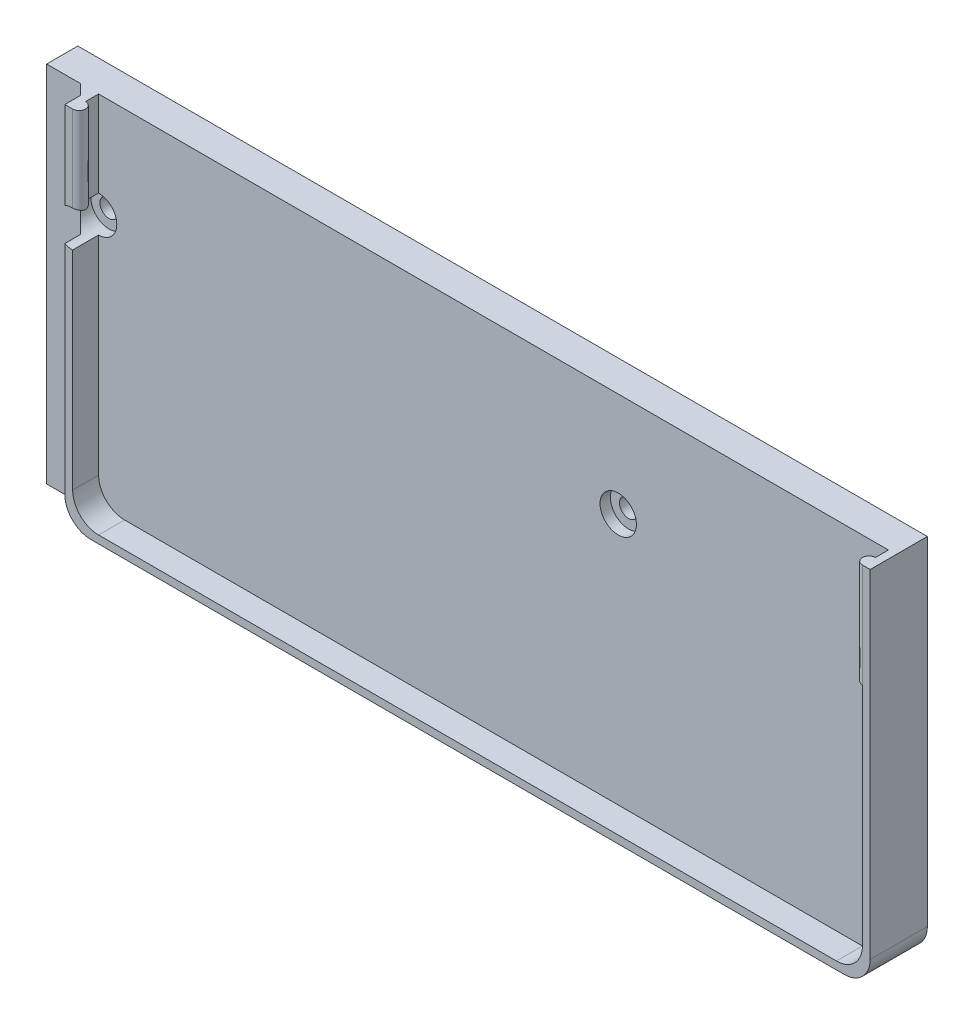
ISO-10303-21;
HEADER;
FILE_DESCRIPTION(('STEP AP214'),'2;1');
FILE_NAME('part.step','',(''),(''),'','','');
FILE_SCHEMA(('AUTOMOTIVE_DESIGN { 1 0 10303 214 1 1 1 1 }'));
ENDSEC;
DATA;
#1=APPLICATION_CONTEXT('core data for automotive mechanical design processes');
#2=APPLICATION_PROTOCOL_DEFINITION('international standard','automotive_design',2000,#1);
#3=PRODUCT_CONTEXT('',#1,'mechanical');
#4=PRODUCT('Part','Part','',(#3));
#5=PRODUCT_RELATED_PRODUCT_CATEGORY('part','',(#4));
#6=PRODUCT_DEFINITION_FORMATION('','',#4);
#7=PRODUCT_DEFINITION_CONTEXT('part definition',#1,'design');
#8=PRODUCT_DEFINITION('design','',#6,#7);
#9=PRODUCT_DEFINITION_SHAPE('','',#8);
#10=(LENGTH_UNIT() NAMED_UNIT(*) SI_UNIT(.MILLI.,.METRE.));
#11=(NAMED_UNIT(*) PLANE_ANGLE_UNIT() SI_UNIT($,.RADIAN.));
#12=(NAMED_UNIT(*) SI_UNIT($,.STERADIAN.) SOLID_ANGLE_UNIT());
#13=UNCERTAINTY_MEASURE_WITH_UNIT(LENGTH_MEASURE(1.E-05),#10,'distance_accuracy_value','');
#14=(GEOMETRIC_REPRESENTATION_CONTEXT(3) GLOBAL_UNCERTAINTY_ASSIGNED_CONTEXT((#13)) GLOBAL_UNIT_ASSIGNED_CONTEXT((#10,
#11,#12)) REPRESENTATION_CONTEXT('',''));
#15=CARTESIAN_POINT('',(0.,0.,0.));
#16=DIRECTION('',(0.,0.,1.));
#17=DIRECTION('',(1.,0.,0.));
#18=AXIS2_PLACEMENT_3D('',#15,#16,#17);
#19=CARTESIAN_POINT('',(-76.,35.,11.));
#20=DIRECTION('',(-1.,0.,0.));
#21=DIRECTION('',(0.,-1.,0.));
#22=AXIS2_PLACEMENT_3D('',#19,#20,#21);
#23=PLANE('',#22);
#24=DIRECTION('',(0.,0.,-1.));
#25=VECTOR('',#24,1.);
#26=CARTESIAN_POINT('',(-76.,18.5,11.));
#27=LINE('',#26,#25);
#28=CARTESIAN_POINT('',(-76.,18.5,6.));
#29=VERTEX_POINT('',#28);
#30=CARTESIAN_POINT('',(-76.,18.5,8.5));
#31=VERTEX_POINT('',#30);
#32=EDGE_CURVE('E203',#29,#31,#27,.F.);
#33=ORIENTED_EDGE('',*,*,#32,.F.);
#34=DIRECTION('',(0.,1.,0.));
#35=VECTOR('',#34,1.);
#36=CARTESIAN_POINT('',(-76.,35.,6.));
#37=LINE('',#36,#35);
#38=CARTESIAN_POINT('',(-76.,35.,6.));
#39=VERTEX_POINT('',#38);
#40=EDGE_CURVE('E289',#29,#39,#37,.T.);
#41=ORIENTED_EDGE('',*,*,#40,.T.);
#42=DIRECTION('',(0.,0.,-1.));
#43=VECTOR('',#42,1.);
#44=CARTESIAN_POINT('',(-76.,35.,11.));
#45=LINE('',#44,#43);
#46=CARTESIAN_POINT('',(-76.,35.,8.5));
#47=VERTEX_POINT('',#46);
#48=EDGE_CURVE('E281',#47,#39,#45,.T.);
#49=ORIENTED_EDGE('',*,*,#48,.F.);
#50=DIRECTION('',(0.,1.,0.));
#51=VECTOR('',#50,1.);
#52=CARTESIAN_POINT('',(-76.,15.,8.5));
#53=LINE('',#52,#51);
#54=EDGE_CURVE('E228',#31,#47,#53,.T.);
#55=ORIENTED_EDGE('',*,*,#54,.F.);
#56=EDGE_LOOP('',(#33,#41,#49,#55));
#57=FACE_BOUND('',#56,.T.);
#58=ADVANCED_FACE('F43',(#57),#23,.F.);
#59=CARTESIAN_POINT('',(-77.5,-35.,6.));
#60=DIRECTION('',(1.,0.,0.));
#61=DIRECTION('',(0.,0.,-1.));
#62=AXIS2_PLACEMENT_3D('',#59,#60,#61);
#63=PLANE('',#62);
#64=DIRECTION('',(0.,0.,-1.));
#65=VECTOR('',#64,1.);
#66=CARTESIAN_POINT('',(-77.5,11.8377223398316,11.));
#67=LINE('',#66,#65);
#68=CARTESIAN_POINT('',(-77.5,11.8377223398316,8.));
#69=VERTEX_POINT('',#68);
#70=CARTESIAN_POINT('',(-77.5,11.8377223398316,11.));
#71=VERTEX_POINT('',#70);
#72=EDGE_CURVE('E454',#69,#71,#67,.F.);
#73=ORIENTED_EDGE('',*,*,#72,.F.);
#74=DIRECTION('',(0.,-1.,0.));
#75=VECTOR('',#74,1.);
#76=CARTESIAN_POINT('',(-77.5,-35.,8.));
#77=LINE('',#76,#75);
#78=CARTESIAN_POINT('',(-77.5,-30.,8.));
#79=VERTEX_POINT('',#78);
#80=EDGE_CURVE('E385',#69,#79,#77,.T.);
#81=ORIENTED_EDGE('',*,*,#80,.T.);
#82=DIRECTION('',(0.,0.,-1.));
#83=VECTOR('',#82,1.);
#84=CARTESIAN_POINT('',(-77.5,-30.,6.));
#85=LINE('',#84,#83);
#86=CARTESIAN_POINT('',(-77.5,-30.,11.));
#87=VERTEX_POINT('',#86);
#88=EDGE_CURVE('E368',#79,#87,#85,.F.);
#89=ORIENTED_EDGE('',*,*,#88,.T.);
#90=DIRECTION('',(0.,-1.,0.));
#91=VECTOR('',#90,1.);
#92=CARTESIAN_POINT('',(-77.5,35.,11.));
#93=LINE('',#92,#91);
#94=EDGE_CURVE('E254',#71,#87,#93,.T.);
#95=ORIENTED_EDGE('',*,*,#94,.F.);
#96=EDGE_LOOP('',(#73,#81,#89,#95));
#97=FACE_BOUND('',#96,.T.);
#98=ADVANCED_FACE('F431',(#97),#63,.F.);
#99=DIRECTION('',(0.,0.,-1.));
#100=VECTOR('',#99,1.);
#101=CARTESIAN_POINT('',(-76.,11.5,11.));
#102=LINE('',#101,#100);
#103=CARTESIAN_POINT('',(-76.,11.5,11.));
#104=VERTEX_POINT('',#103);
#105=CARTESIAN_POINT('',(-76.,11.5,6.));
#106=VERTEX_POINT('',#105);
#107=EDGE_CURVE('E208',#104,#106,#102,.T.);
#108=ORIENTED_EDGE('',*,*,#107,.F.);
#109=DIRECTION('',(0.,1.,0.));
#110=VECTOR('',#109,1.);
#111=CARTESIAN_POINT('',(-76.,35.,11.));
#112=LINE('',#111,#110);
#113=CARTESIAN_POINT('',(-76.,-28.5,11.));
#114=VERTEX_POINT('',#113);
#115=EDGE_CURVE('E274',#114,#104,#112,.T.);
#116=ORIENTED_EDGE('',*,*,#115,.F.);
#117=DIRECTION('',(0.,0.,-1.));
#118=VECTOR('',#117,1.);
#119=CARTESIAN_POINT('',(-76.,-28.5,6.));
#120=LINE('',#119,#118);
#121=CARTESIAN_POINT('',(-76.,-28.5,6.));
#122=VERTEX_POINT('',#121);
#123=EDGE_CURVE('E338',#114,#122,#120,.T.);
#124=ORIENTED_EDGE('',*,*,#123,.T.);
#125=EDGE_CURVE('E290',#122,#106,#37,.T.);
#126=ORIENTED_EDGE('',*,*,#125,.T.);
#127=EDGE_LOOP('',(#108,#116,#124,#126));
#128=FACE_BOUND('',#127,.T.);
#129=ADVANCED_FACE('F434',(#128),#23,.F.);
#130=DIRECTION('',(0.,0.,-1.));
#131=VECTOR('',#130,1.);
#132=CARTESIAN_POINT('',(-77.5,35.,6.));
#133=LINE('',#132,#131);
#134=CARTESIAN_POINT('',(-77.5,35.,11.));
#135=VERTEX_POINT('',#134);
#136=CARTESIAN_POINT('',(-77.5,35.,8.));
#137=VERTEX_POINT('',#136);
#138=EDGE_CURVE('E305',#135,#137,#133,.T.);
#139=ORIENTED_EDGE('',*,*,#138,.T.);
#140=DIRECTION('',(0.,-1.,0.));
#141=VECTOR('',#140,1.);
#142=CARTESIAN_POINT('',(-77.5,-35.,8.));
#143=LINE('',#142,#141);
#144=CARTESIAN_POINT('',(-77.5,18.1622776601683,8.));
#145=VERTEX_POINT('',#144);
#146=EDGE_CURVE('E388',#137,#145,#143,.T.);
#147=ORIENTED_EDGE('',*,*,#146,.T.);
#148=DIRECTION('',(0.,0.,-1.));
#149=VECTOR('',#148,1.);
#150=CARTESIAN_POINT('',(-77.5,18.1622776601683,11.));
#151=LINE('',#150,#149);
#152=CARTESIAN_POINT('',(-77.5,18.1622776601683,11.));
#153=VERTEX_POINT('',#152);
#154=EDGE_CURVE('E219',#153,#145,#151,.T.);
#155=ORIENTED_EDGE('',*,*,#154,.F.);
#156=EDGE_CURVE('E217',#135,#153,#93,.T.);
#157=ORIENTED_EDGE('',*,*,#156,.F.);
#158=EDGE_LOOP('',(#139,#147,#155,#157));
#159=FACE_BOUND('',#158,.T.);
#160=ADVANCED_FACE('F439',(#159),#63,.F.);
#161=CARTESIAN_POINT('',(-76.,15.,9.75));
#162=DIRECTION('',(0.,1.,0.));
#163=DIRECTION('',(-1.,0.,0.));
#164=AXIS2_PLACEMENT_3D('',#161,#162,#163);
#165=CYLINDRICAL_SURFACE('',#164,1.25);
#166=CARTESIAN_POINT('',(-76.,18.5,8.5));
#167=CARTESIAN_POINT('',(-75.9659757904319,18.5000026683283,8.49999907683071));
#168=CARTESIAN_POINT('',(-75.9319688547805,18.4995032816792,8.50139008495954));
#169=CARTESIAN_POINT('',(-75.864217584946,18.4975289487794,8.50693175917107));
#170=CARTESIAN_POINT('',(-75.8304731865727,18.4960542490934,8.51108172777475));
#171=CARTESIAN_POINT('',(-75.7302073943591,18.4902245695908,8.5275924385276));
#172=CARTESIAN_POINT('',(-75.6643885949796,18.4844635651872,8.54401442577793));
#173=CARTESIAN_POINT('',(-75.5366547082636,18.4697918359865,8.58708958889776));
#174=CARTESIAN_POINT('',(-75.4747377608142,18.4608826256113,8.61373784602236));
#175=CARTESIAN_POINT('',(-75.3562241417227,18.440809192101,8.67643185981238));
#176=CARTESIAN_POINT('',(-75.2996305798288,18.4296436627403,8.71248306355123));
#177=CARTESIAN_POINT('',(-75.1912060790333,18.4057370816355,8.79442096281969));
#178=CARTESIAN_POINT('',(-75.1396113591823,18.392954546177,8.84060790552855));
#179=CARTESIAN_POINT('',(-75.0447105996287,18.3674680187645,8.94087143656938));
#180=CARTESIAN_POINT('',(-75.0014070313663,18.3547640513187,8.99495036891979));
#181=CARTESIAN_POINT('',(-74.922880473595,18.3304001061877,9.11170007488475));
#182=CARTESIAN_POINT('',(-74.8879809552402,18.3187900803079,9.17459986308374));
#183=CARTESIAN_POINT('',(-74.8293612147054,18.2985714206393,9.3058545348867));
#184=CARTESIAN_POINT('',(-74.8056365584818,18.289961596762,9.37420724223113));
#185=CARTESIAN_POINT('',(-74.770954515659,18.2771602545628,9.51171073731794));
#186=CARTESIAN_POINT('',(-74.7595476309359,18.2728137537401,9.58073326043892));
#187=CARTESIAN_POINT('',(-74.7484192355344,18.2685753081462,9.71984040223422));
#188=CARTESIAN_POINT('',(-74.7486936919814,18.2686818260114,9.78992464600614));
#189=CARTESIAN_POINT('',(-74.7605746424022,18.273202956084,9.92517826816106));
#190=CARTESIAN_POINT('',(-74.7715743349314,18.2773868746983,9.99041004961843));
#191=CARTESIAN_POINT('',(-74.8035960297355,18.289210512782,10.1180315991849));
#192=CARTESIAN_POINT('',(-74.8246192674017,18.2968506582217,10.1804210159368));
#193=CARTESIAN_POINT('',(-74.8764521600179,18.3148758556283,10.3018868924054));
#194=CARTESIAN_POINT('',(-74.9074289864255,18.3253072461456,10.3608848378626));
#195=CARTESIAN_POINT('',(-74.9781737204176,18.3477223570999,10.4730282359576));
#196=CARTESIAN_POINT('',(-75.0179444487767,18.3597065751175,10.5261718025031));
#197=CARTESIAN_POINT('',(-75.1079806205524,18.3847615419392,10.6284758978067));
#198=CARTESIAN_POINT('',(-75.1587350177102,18.3978541865051,10.6772016768853));
#199=CARTESIAN_POINT('',(-75.2678612729399,18.4230255783854,10.7655800316741));
#200=CARTESIAN_POINT('',(-75.3262352118476,18.4351040472505,10.8052301207113));
#201=CARTESIAN_POINT('',(-75.4499807941009,18.4570910587843,10.8747592459903));
#202=CARTESIAN_POINT('',(-75.5154353921905,18.4669685082592,10.9045008936965));
#203=CARTESIAN_POINT('',(-75.6508270205677,18.4832028361184,10.9523787560176));
#204=CARTESIAN_POINT('',(-75.7207572036335,18.4895649554513,10.9705322535262));
#205=CARTESIAN_POINT('',(-75.8261479716852,18.4958506132377,10.988344283457));
#206=CARTESIAN_POINT('',(-75.860776369585,18.4974025097797,10.9927127455016));
#207=CARTESIAN_POINT('',(-75.9302635093121,18.4994779139932,10.9985390828793));
#208=CARTESIAN_POINT('',(-75.9651219053432,18.5000027168634,11.0000006239726));
#209=CARTESIAN_POINT('',(-76.,18.5000000000001,11.0000000000002));
#210=B_SPLINE_CURVE_WITH_KNOTS('',3,(#166,#167,#168,#169,#170,#171,#172,#173,#174,#175,#176,
#177,#178,#179,#180,#181,#182,#183,#184,#185,#186,#187,#188,#189,#190,#191,#192,#193,#194,#195,
#196,#197,#198,#199,#200,#201,#202,#203,#204,#205,#206,#207,#208,#209),.UNSPECIFIED.,.F.,.F.,(4,
2,2,2,2,2,2,2,2,2,2,2,2,2,2,2,2,2,2,2,2,4),(0.,0.102006778343278,0.203987778663533,
0.407165932526253,0.610246481746047,0.813444936675671,1.02375999820424,1.23413765352075,
1.45164280743171,1.66906158520247,1.8782461980126,2.08735859236272,2.2852880405023,
2.48324188954616,2.68471130666592,2.88624544208698,3.09995801092077,3.31372906553626,
3.53035156417599,3.7466502263919,3.85134354778704,3.9559047622036),.UNSPECIFIED.);
#211=CARTESIAN_POINT('',(-76.,18.5,11.));
#212=VERTEX_POINT('',#211);
#213=EDGE_CURVE('E196',#31,#212,#210,.T.);
#214=ORIENTED_EDGE('',*,*,#213,.F.);
#215=ORIENTED_EDGE('',*,*,#54,.T.);
#216=CARTESIAN_POINT('',(-76.,35.,9.75));
#217=DIRECTION('',(0.,-1.,0.));
#218=DIRECTION('',(1.,0.,0.));
#219=AXIS2_PLACEMENT_3D('',#216,#217,#218);
#220=CIRCLE('',#219,1.25);
#221=CARTESIAN_POINT('',(-76.,35.,11.));
#222=VERTEX_POINT('',#221);
#223=EDGE_CURVE('E224',#47,#222,#220,.T.);
#224=ORIENTED_EDGE('',*,*,#223,.T.);
#225=DIRECTION('',(0.,1.,0.));
#226=VECTOR('',#225,1.);
#227=CARTESIAN_POINT('',(-76.,15.,11.));
#228=LINE('',#227,#226);
#229=EDGE_CURVE('E214',#212,#222,#228,.T.);
#230=ORIENTED_EDGE('',*,*,#229,.F.);
#231=EDGE_LOOP('',(#214,#215,#224,#230));
#232=FACE_BOUND('',#231,.T.);
#233=ADVANCED_FACE('F222',(#232),#165,.T.);
#234=CARTESIAN_POINT('',(0.,0.,11.));
#235=DIRECTION('',(0.,0.,1.));
#236=DIRECTION('',(1.,0.,0.));
#237=AXIS2_PLACEMENT_3D('',#234,#235,#236);
#238=PLANE('',#237);
#239=ORIENTED_EDGE('',*,*,#156,.T.);
#240=CARTESIAN_POINT('',(-76.,15.,11.));
#241=DIRECTION('',(0.,0.,1.));
#242=DIRECTION('',(1.,0.,0.));
#243=AXIS2_PLACEMENT_3D('',#240,#241,#242);
#244=CIRCLE('',#243,3.50000000000001);
#245=EDGE_CURVE('E201',#212,#153,#244,.T.);
#246=ORIENTED_EDGE('',*,*,#245,.F.);
#247=ORIENTED_EDGE('',*,*,#229,.T.);
#248=DIRECTION('',(-1.,0.,0.));
#249=VECTOR('',#248,1.);
#250=CARTESIAN_POINT('',(-77.5,35.,11.));
#251=LINE('',#250,#249);
#252=EDGE_CURVE('E278',#222,#135,#251,.T.);
#253=ORIENTED_EDGE('',*,*,#252,.T.);
#254=EDGE_LOOP('',(#239,#246,#247,#253));
#255=FACE_BOUND('',#254,.T.);
#256=ADVANCED_FACE('F212',(#255),#238,.T.);
#257=CARTESIAN_POINT('',(77.5,-35.,6.));
#258=DIRECTION('',(0.,1.,0.));
#259=DIRECTION('',(-1.,0.,0.));
#260=AXIS2_PLACEMENT_3D('',#257,#258,#259);
#261=PLANE('',#260);
#262=DIRECTION('',(1.,0.,0.));
#263=VECTOR('',#262,1.);
#264=CARTESIAN_POINT('',(77.5,-35.,0.));
#265=LINE('',#264,#263);
#266=CARTESIAN_POINT('',(-86.,-35.,0.));
#267=VERTEX_POINT('',#266);
#268=CARTESIAN_POINT('',(72.5,-35.,0.));
#269=VERTEX_POINT('',#268);
#270=EDGE_CURVE('E300',#267,#269,#265,.T.);
#271=ORIENTED_EDGE('',*,*,#270,.T.);
#272=DIRECTION('',(0.,0.,-1.));
#273=VECTOR('',#272,1.);
#274=CARTESIAN_POINT('',(72.5,-35.,6.));
#275=LINE('',#274,#273);
#276=CARTESIAN_POINT('',(72.5,-35.,11.));
#277=VERTEX_POINT('',#276);
#278=EDGE_CURVE('E359',#269,#277,#275,.F.);
#279=ORIENTED_EDGE('',*,*,#278,.T.);
#280=DIRECTION('',(1.,0.,0.));
#281=VECTOR('',#280,1.);
#282=CARTESIAN_POINT('',(-77.5,-35.,11.));
#283=LINE('',#282,#281);
#284=CARTESIAN_POINT('',(-72.5,-35.,11.));
#285=VERTEX_POINT('',#284);
#286=EDGE_CURVE('E253',#285,#277,#283,.T.);
#287=ORIENTED_EDGE('',*,*,#286,.F.);
#288=DIRECTION('',(0.,0.,-1.));
#289=VECTOR('',#288,1.);
#290=CARTESIAN_POINT('',(-72.5,-35.,6.));
#291=LINE('',#290,#289);
#292=CARTESIAN_POINT('',(-72.5,-35.,8.));
#293=VERTEX_POINT('',#292);
#294=EDGE_CURVE('E355',#285,#293,#291,.T.);
#295=ORIENTED_EDGE('',*,*,#294,.T.);
#296=CARTESIAN_POINT('',(-72.5,-35.,8.));
#297=CARTESIAN_POINT('',(-72.5768933228156,-35.,8.00000620131336));
#298=CARTESIAN_POINT('',(-72.6537753473376,-35.,7.99822533589672));
#299=CARTESIAN_POINT('',(-72.8073651302601,-35.,7.99114778382127));
#300=CARTESIAN_POINT('',(-72.8840729152158,-35.,7.9858516748292));
#301=CARTESIAN_POINT('',(-73.1134205585133,-35.,7.96480683785419));
#302=CARTESIAN_POINT('',(-73.2656120972033,-35.,7.94390110288721));
#303=CARTESIAN_POINT('',(-73.5650305487638,-35.,7.88991735069916));
#304=CARTESIAN_POINT('',(-73.7122977683057,-35.,7.85705747256989));
#305=CARTESIAN_POINT('',(-74.0040195360666,-35.,7.78058856410912));
#306=CARTESIAN_POINT('',(-74.1484732137249,-35.,7.73697626205266));
#307=CARTESIAN_POINT('',(-74.5663706327561,-35.,7.59604187330244));
#308=CARTESIAN_POINT('',(-74.8356598401198,-35.,7.4863290838687));
#309=CARTESIAN_POINT('',(-75.231312657729,-35.,7.30382931353176));
#310=CARTESIAN_POINT('',(-75.3619881348855,-35.,7.23990883041286));
#311=CARTESIAN_POINT('',(-75.6207671752578,-35.,7.10705031745801));
#312=CARTESIAN_POINT('',(-75.7488710267653,-35.,7.03811285410279));
#313=CARTESIAN_POINT('',(-76.0074735057834,-35.,6.89340854084567));
#314=CARTESIAN_POINT('',(-76.1378824406127,-35.,6.81748268239323));
#315=CARTESIAN_POINT('',(-76.3964566201314,-35.,6.66188374413012));
#316=CARTESIAN_POINT('',(-76.5246216538159,-35.,6.58221031448676));
#317=CARTESIAN_POINT('',(-76.7781667463039,-35.,6.42024010655214));
#318=CARTESIAN_POINT('',(-76.9035590847409,-35.,6.33796247399148));
#319=CARTESIAN_POINT('',(-77.1525491232897,-35.,6.17081460821925));
#320=CARTESIAN_POINT('',(-77.2761473712528,-35.,6.08594519210924));
#321=CARTESIAN_POINT('',(-77.3989794855663,-35.,6.00000000000001));
#322=B_SPLINE_CURVE_WITH_KNOTS('',3,(#296,#297,#298,#299,#300,#301,#302,#303,#304,#305,#306,
#307,#308,#309,#310,#311,#312,#313,#314,#315,#316,#317,#318,#319,#320,#321),.UNSPECIFIED.,.F.,
.F.,(4,2,2,2,2,2,2,2,2,2,2,2,4),(0.,0.230637768104905,0.461237644442019,0.921458930578871,
1.37367193963626,1.82602271730549,2.6963792839674,3.13274134755843,3.56905421655104,
4.02168948163026,4.47436708402284,4.92426088396873,5.37401428286144),.UNSPECIFIED.);
#323=CARTESIAN_POINT('',(-77.3989794855663,-35.,6.00000000000001));
#324=VERTEX_POINT('',#323);
#325=EDGE_CURVE('E391',#293,#324,#322,.T.);
#326=ORIENTED_EDGE('',*,*,#325,.T.);
#327=DIRECTION('',(-1.,0.,0.));
#328=VECTOR('',#327,1.);
#329=CARTESIAN_POINT('',(0.,-35.,6.00000000000001));
#330=LINE('',#329,#328);
#331=CARTESIAN_POINT('',(-86.,-35.,6.00000000000001));
#332=VERTEX_POINT('',#331);
#333=EDGE_CURVE('E502',#324,#332,#330,.T.);
#334=ORIENTED_EDGE('',*,*,#333,.T.);
#335=DIRECTION('',(0.,0.,-1.));
#336=VECTOR('',#335,1.);
#337=CARTESIAN_POINT('',(-86.,-35.,77.2899011080813));
#338=LINE('',#337,#336);
#339=EDGE_CURVE('E505',#332,#267,#338,.T.);
#340=ORIENTED_EDGE('',*,*,#339,.T.);
#341=EDGE_LOOP('',(#271,#279,#287,#295,#326,#334,#340));
#342=FACE_BOUND('',#341,.T.);
#343=ADVANCED_FACE('F402',(#342),#261,.F.);
#344=CARTESIAN_POINT('',(77.5,-35.,6.));
#345=DIRECTION('',(-1.,0.,0.));
#346=DIRECTION('',(0.,0.,1.));
#347=AXIS2_PLACEMENT_3D('',#344,#345,#346);
#348=PLANE('',#347);
#349=DIRECTION('',(0.,1.,0.));
#350=VECTOR('',#349,1.);
#351=CARTESIAN_POINT('',(77.5,-35.,11.));
#352=LINE('',#351,#350);
#353=CARTESIAN_POINT('',(77.5,-30.,11.));
#354=VERTEX_POINT('',#353);
#355=CARTESIAN_POINT('',(77.5,35.,11.));
#356=VERTEX_POINT('',#355);
#357=EDGE_CURVE('E258',#354,#356,#352,.T.);
#358=ORIENTED_EDGE('',*,*,#357,.F.);
#359=DIRECTION('',(0.,0.,-1.));
#360=VECTOR('',#359,1.);
#361=CARTESIAN_POINT('',(77.5,-30.,6.));
#362=LINE('',#361,#360);
#363=CARTESIAN_POINT('',(77.5,-30.,0.));
#364=VERTEX_POINT('',#363);
#365=EDGE_CURVE('E348',#354,#364,#362,.T.);
#366=ORIENTED_EDGE('',*,*,#365,.T.);
#367=DIRECTION('',(0.,1.,0.));
#368=VECTOR('',#367,1.);
#369=CARTESIAN_POINT('',(77.5,-35.,0.));
#370=LINE('',#369,#368);
#371=CARTESIAN_POINT('',(77.5,35.,0.));
#372=VERTEX_POINT('',#371);
#373=EDGE_CURVE('E310',#364,#372,#370,.T.);
#374=ORIENTED_EDGE('',*,*,#373,.T.);
#375=DIRECTION('',(0.,0.,-1.));
#376=VECTOR('',#375,1.);
#377=CARTESIAN_POINT('',(77.5,35.,6.));
#378=LINE('',#377,#376);
#379=EDGE_CURVE('E317',#356,#372,#378,.T.);
#380=ORIENTED_EDGE('',*,*,#379,.F.);
#381=EDGE_LOOP('',(#358,#366,#374,#380));
#382=FACE_BOUND('',#381,.T.);
#383=ADVANCED_FACE('F535',(#382),#348,.F.);
#384=CARTESIAN_POINT('',(77.5,35.,6.));
#385=DIRECTION('',(0.,-1.,0.));
#386=DIRECTION('',(1.,0.,0.));
#387=AXIS2_PLACEMENT_3D('',#384,#385,#386);
#388=PLANE('',#387);
#389=DIRECTION('',(-1.,0.,0.));
#390=VECTOR('',#389,1.);
#391=CARTESIAN_POINT('',(77.5,35.,0.));
#392=LINE('',#391,#390);
#393=CARTESIAN_POINT('',(-86.,35.,0.));
#394=VERTEX_POINT('',#393);
#395=EDGE_CURVE('E306',#372,#394,#392,.T.);
#396=ORIENTED_EDGE('',*,*,#395,.T.);
#397=DIRECTION('',(0.,0.,-1.));
#398=VECTOR('',#397,1.);
#399=CARTESIAN_POINT('',(-86.,35.,77.2899011080813));
#400=LINE('',#399,#398);
#401=CARTESIAN_POINT('',(-86.,35.,6.00000000000001));
#402=VERTEX_POINT('',#401);
#403=EDGE_CURVE('E501',#402,#394,#400,.T.);
#404=ORIENTED_EDGE('',*,*,#403,.F.);
#405=DIRECTION('',(-1.,0.,0.));
#406=VECTOR('',#405,1.);
#407=CARTESIAN_POINT('',(0.,35.,6.00000000000001));
#408=LINE('',#407,#406);
#409=CARTESIAN_POINT('',(-79.5,35.,6.00000000000001));
#410=VERTEX_POINT('',#409);
#411=EDGE_CURVE('E493',#410,#402,#408,.T.);
#412=ORIENTED_EDGE('',*,*,#411,.F.);
#413=DIRECTION('',(0.707106781186548,0.,0.707106781186548));
#414=VECTOR('',#413,1.);
#415=CARTESIAN_POINT('',(-0.999999999999973,35.,84.5));
#416=LINE('',#415,#414);
#417=EDGE_CURVE('E11',#410,#137,#416,.T.);
#418=ORIENTED_EDGE('',*,*,#417,.T.);
#419=ORIENTED_EDGE('',*,*,#138,.F.);
#420=ORIENTED_EDGE('',*,*,#252,.F.);
#421=ORIENTED_EDGE('',*,*,#223,.F.);
#422=ORIENTED_EDGE('',*,*,#48,.T.);
#423=DIRECTION('',(-1.,0.,0.));
#424=VECTOR('',#423,1.);
#425=CARTESIAN_POINT('',(77.5,35.,6.));
#426=LINE('',#425,#424);
#427=CARTESIAN_POINT('',(76.,35.,6.));
#428=VERTEX_POINT('',#427);
#429=EDGE_CURVE('E301',#428,#39,#426,.T.);
#430=ORIENTED_EDGE('',*,*,#429,.F.);
#431=DIRECTION('',(0.,0.,-1.));
#432=VECTOR('',#431,1.);
#433=CARTESIAN_POINT('',(76.,35.,11.));
#434=LINE('',#433,#432);
#435=CARTESIAN_POINT('',(76.,35.,8.5));
#436=VERTEX_POINT('',#435);
#437=EDGE_CURVE('E297',#436,#428,#434,.T.);
#438=ORIENTED_EDGE('',*,*,#437,.F.);
#439=CARTESIAN_POINT('',(76.,35.,9.75));
#440=DIRECTION('',(0.,1.,0.));
#441=DIRECTION('',(-1.,0.,0.));
#442=AXIS2_PLACEMENT_3D('',#439,#440,#441);
#443=CIRCLE('',#442,1.25);
#444=CARTESIAN_POINT('',(76.,35.,11.));
#445=VERTEX_POINT('',#444);
#446=EDGE_CURVE('E227',#436,#445,#443,.T.);
#447=ORIENTED_EDGE('',*,*,#446,.T.);
#448=DIRECTION('',(-1.,0.,0.));
#449=VECTOR('',#448,1.);
#450=CARTESIAN_POINT('',(77.5,35.,11.));
#451=LINE('',#450,#449);
#452=EDGE_CURVE('E261',#356,#445,#451,.T.);
#453=ORIENTED_EDGE('',*,*,#452,.F.);
#454=ORIENTED_EDGE('',*,*,#379,.T.);
#455=EDGE_LOOP('',(#396,#404,#412,#418,#419,#420,#421,#422,#430,#438,#447,#453,#454));
#456=FACE_BOUND('',#455,.T.);
#457=ADVANCED_FACE('F550',(#456),#388,.F.);
#458=CARTESIAN_POINT('',(0.,0.,6.));
#459=DIRECTION('',(0.,0.,1.));
#460=DIRECTION('',(1.,0.,0.));
#461=AXIS2_PLACEMENT_3D('',#458,#459,#460);
#462=PLANE('',#461);
#463=CARTESIAN_POINT('',(24.,15.,6.));
#464=DIRECTION('',(0.,0.,1.));
#465=DIRECTION('',(1.,0.,0.));
#466=AXIS2_PLACEMENT_3D('',#463,#464,#465);
#467=CIRCLE('',#466,3.5);
#468=CARTESIAN_POINT('',(27.5,15.,6.));
#469=VERTEX_POINT('',#468);
#470=EDGE_CURVE('E850',#469,#469,#467,.T.);
#471=ORIENTED_EDGE('',*,*,#470,.F.);
#472=EDGE_LOOP('',(#471));
#473=FACE_BOUND('',#472,.T.);
#474=CARTESIAN_POINT('',(-76.,15.,6.));
#475=DIRECTION('',(0.,0.,1.));
#476=DIRECTION('',(1.,0.,0.));
#477=AXIS2_PLACEMENT_3D('',#474,#475,#476);
#478=CIRCLE('',#477,3.5);
#479=EDGE_CURVE('E470',#106,#29,#478,.T.);
#480=ORIENTED_EDGE('',*,*,#479,.F.);
#481=ORIENTED_EDGE('',*,*,#125,.F.);
#482=CARTESIAN_POINT('',(-71.,-28.5,6.));
#483=DIRECTION('',(0.,0.,1.));
#484=DIRECTION('',(1.,0.,0.));
#485=AXIS2_PLACEMENT_3D('',#482,#483,#484);
#486=CIRCLE('',#485,5.);
#487=CARTESIAN_POINT('',(-71.,-33.5,6.));
#488=VERTEX_POINT('',#487);
#489=EDGE_CURVE('E328',#122,#488,#486,.T.);
#490=ORIENTED_EDGE('',*,*,#489,.T.);
#491=DIRECTION('',(-1.,0.,0.));
#492=VECTOR('',#491,1.);
#493=CARTESIAN_POINT('',(-76.,-33.5,6.));
#494=LINE('',#493,#492);
#495=CARTESIAN_POINT('',(71.,-33.5,6.));
#496=VERTEX_POINT('',#495);
#497=EDGE_CURVE('E285',#496,#488,#494,.T.);
#498=ORIENTED_EDGE('',*,*,#497,.F.);
#499=CARTESIAN_POINT('',(71.,-28.5,6.));
#500=DIRECTION('',(0.,0.,1.));
#501=DIRECTION('',(1.,0.,0.));
#502=AXIS2_PLACEMENT_3D('',#499,#500,#501);
#503=CIRCLE('',#502,5.);
#504=CARTESIAN_POINT('',(76.,-28.5,6.));
#505=VERTEX_POINT('',#504);
#506=EDGE_CURVE('E331',#496,#505,#503,.T.);
#507=ORIENTED_EDGE('',*,*,#506,.T.);
#508=DIRECTION('',(0.,-1.,0.));
#509=VECTOR('',#508,1.);
#510=CARTESIAN_POINT('',(76.,-33.5,6.));
#511=LINE('',#510,#509);
#512=EDGE_CURVE('E250',#428,#505,#511,.T.);
#513=ORIENTED_EDGE('',*,*,#512,.F.);
#514=ORIENTED_EDGE('',*,*,#429,.T.);
#515=ORIENTED_EDGE('',*,*,#40,.F.);
#516=EDGE_LOOP('',(#480,#481,#490,#498,#507,#513,#514,#515));
#517=FACE_BOUND('',#516,.T.);
#518=ADVANCED_FACE('F467',(#473,#517),#462,.T.);
#519=CARTESIAN_POINT('',(0.,0.,0.));
#520=DIRECTION('',(0.,0.,1.));
#521=DIRECTION('',(1.,0.,0.));
#522=AXIS2_PLACEMENT_3D('',#519,#520,#521);
#523=PLANE('',#522);
#524=CARTESIAN_POINT('',(-76.,15.,0.));
#525=DIRECTION('',(0.,0.,-1.));
#526=DIRECTION('',(-1.,0.,0.));
#527=AXIS2_PLACEMENT_3D('',#524,#525,#526);
#528=CIRCLE('',#527,1.75);
#529=CARTESIAN_POINT('',(-77.75,15.,0.));
#530=VERTEX_POINT('',#529);
#531=EDGE_CURVE('E489',#530,#530,#528,.T.);
#532=ORIENTED_EDGE('',*,*,#531,.F.);
#533=EDGE_LOOP('',(#532));
#534=FACE_BOUND('',#533,.T.);
#535=CARTESIAN_POINT('',(24.,15.,0.));
#536=DIRECTION('',(0.,0.,-1.));
#537=DIRECTION('',(-1.,0.,0.));
#538=AXIS2_PLACEMENT_3D('',#535,#536,#537);
#539=CIRCLE('',#538,1.75);
#540=CARTESIAN_POINT('',(22.25,15.,0.));
#541=VERTEX_POINT('',#540);
#542=EDGE_CURVE('E488',#541,#541,#539,.T.);
#543=ORIENTED_EDGE('',*,*,#542,.F.);
#544=EDGE_LOOP('',(#543));
#545=FACE_BOUND('',#544,.T.);
#546=ORIENTED_EDGE('',*,*,#373,.F.);
#547=CARTESIAN_POINT('',(72.5,-30.,0.));
#548=DIRECTION('',(0.,0.,1.));
#549=DIRECTION('',(1.,0.,0.));
#550=AXIS2_PLACEMENT_3D('',#547,#548,#549);
#551=CIRCLE('',#550,5.);
#552=EDGE_CURVE('E352',#364,#269,#551,.F.);
#553=ORIENTED_EDGE('',*,*,#552,.T.);
#554=ORIENTED_EDGE('',*,*,#270,.F.);
#555=DIRECTION('',(0.,-1.,0.));
#556=VECTOR('',#555,1.);
#557=CARTESIAN_POINT('',(-86.,0.,0.));
#558=LINE('',#557,#556);
#559=EDGE_CURVE('E497',#394,#267,#558,.T.);
#560=ORIENTED_EDGE('',*,*,#559,.F.);
#561=ORIENTED_EDGE('',*,*,#395,.F.);
#562=EDGE_LOOP('',(#546,#553,#554,#560,#561));
#563=FACE_BOUND('',#562,.T.);
#564=ADVANCED_FACE('F528',(#534,#545,#563),#523,.F.);
#565=CARTESIAN_POINT('',(76.,-33.5,11.));
#566=DIRECTION('',(1.,0.,0.));
#567=DIRECTION('',(0.,0.,-1.));
#568=AXIS2_PLACEMENT_3D('',#565,#566,#567);
#569=PLANE('',#568);
#570=DIRECTION('',(0.,0.,-1.));
#571=VECTOR('',#570,1.);
#572=CARTESIAN_POINT('',(76.,15.,11.));
#573=LINE('',#572,#571);
#574=CARTESIAN_POINT('',(76.,15.,11.));
#575=VERTEX_POINT('',#574);
#576=CARTESIAN_POINT('',(76.,15.,8.5));
#577=VERTEX_POINT('',#576);
#578=EDGE_CURVE('E242',#575,#577,#573,.T.);
#579=ORIENTED_EDGE('',*,*,#578,.T.);
#580=DIRECTION('',(0.,1.,0.));
#581=VECTOR('',#580,1.);
#582=CARTESIAN_POINT('',(76.,15.,8.5));
#583=LINE('',#582,#581);
#584=EDGE_CURVE('E245',#577,#436,#583,.T.);
#585=ORIENTED_EDGE('',*,*,#584,.T.);
#586=ORIENTED_EDGE('',*,*,#437,.T.);
#587=ORIENTED_EDGE('',*,*,#512,.T.);
#588=DIRECTION('',(0.,0.,-1.));
#589=VECTOR('',#588,1.);
#590=CARTESIAN_POINT('',(76.,-28.5,11.));
#591=LINE('',#590,#589);
#592=CARTESIAN_POINT('',(76.,-28.5,11.));
#593=VERTEX_POINT('',#592);
#594=EDGE_CURVE('E334',#505,#593,#591,.F.);
#595=ORIENTED_EDGE('',*,*,#594,.T.);
#596=DIRECTION('',(0.,-1.,0.));
#597=VECTOR('',#596,1.);
#598=CARTESIAN_POINT('',(76.,-33.5,11.));
#599=LINE('',#598,#597);
#600=EDGE_CURVE('E265',#575,#593,#599,.T.);
#601=ORIENTED_EDGE('',*,*,#600,.F.);
#602=EDGE_LOOP('',(#579,#585,#586,#587,#595,#601));
#603=FACE_BOUND('',#602,.T.);
#604=ADVANCED_FACE('F557',(#603),#569,.F.);
#605=CARTESIAN_POINT('',(-76.,-33.5,11.));
#606=DIRECTION('',(0.,-1.,0.));
#607=DIRECTION('',(1.,0.,0.));
#608=AXIS2_PLACEMENT_3D('',#605,#606,#607);
#609=PLANE('',#608);
#610=DIRECTION('',(-1.,0.,0.));
#611=VECTOR('',#610,1.);
#612=CARTESIAN_POINT('',(-76.,-33.5,11.));
#613=LINE('',#612,#611);
#614=CARTESIAN_POINT('',(71.,-33.5,11.));
#615=VERTEX_POINT('',#614);
#616=CARTESIAN_POINT('',(-71.,-33.5,11.));
#617=VERTEX_POINT('',#616);
#618=EDGE_CURVE('E270',#615,#617,#613,.T.);
#619=ORIENTED_EDGE('',*,*,#618,.F.);
#620=DIRECTION('',(0.,0.,-1.));
#621=VECTOR('',#620,1.);
#622=CARTESIAN_POINT('',(71.,-33.5,6.));
#623=LINE('',#622,#621);
#624=EDGE_CURVE('E324',#615,#496,#623,.T.);
#625=ORIENTED_EDGE('',*,*,#624,.T.);
#626=ORIENTED_EDGE('',*,*,#497,.T.);
#627=DIRECTION('',(0.,0.,-1.));
#628=VECTOR('',#627,1.);
#629=CARTESIAN_POINT('',(-71.,-33.5,11.));
#630=LINE('',#629,#628);
#631=EDGE_CURVE('E321',#488,#617,#630,.F.);
#632=ORIENTED_EDGE('',*,*,#631,.T.);
#633=EDGE_LOOP('',(#619,#625,#626,#632));
#634=FACE_BOUND('',#633,.T.);
#635=ADVANCED_FACE('F574',(#634),#609,.F.);
#636=ORIENTED_EDGE('',*,*,#115,.T.);
#637=EDGE_CURVE('E220',#71,#104,#244,.T.);
#638=ORIENTED_EDGE('',*,*,#637,.F.);
#639=ORIENTED_EDGE('',*,*,#94,.T.);
#640=CARTESIAN_POINT('',(-72.5,-30.,11.));
#641=DIRECTION('',(0.,0.,1.));
#642=DIRECTION('',(1.,0.,0.));
#643=AXIS2_PLACEMENT_3D('',#640,#641,#642);
#644=CIRCLE('',#643,5.);
#645=EDGE_CURVE('E362',#87,#285,#644,.T.);
#646=ORIENTED_EDGE('',*,*,#645,.T.);
#647=ORIENTED_EDGE('',*,*,#286,.T.);
#648=CARTESIAN_POINT('',(72.5,-30.,11.));
#649=DIRECTION('',(0.,0.,1.));
#650=DIRECTION('',(1.,0.,0.));
#651=AXIS2_PLACEMENT_3D('',#648,#649,#650);
#652=CIRCLE('',#651,5.);
#653=EDGE_CURVE('E365',#277,#354,#652,.T.);
#654=ORIENTED_EDGE('',*,*,#653,.T.);
#655=ORIENTED_EDGE('',*,*,#357,.T.);
#656=ORIENTED_EDGE('',*,*,#452,.T.);
#657=EDGE_CURVE('E266',#445,#575,#599,.T.);
#658=ORIENTED_EDGE('',*,*,#657,.T.);
#659=ORIENTED_EDGE('',*,*,#600,.T.);
#660=CARTESIAN_POINT('',(71.,-28.5,11.));
#661=DIRECTION('',(0.,0.,1.));
#662=DIRECTION('',(1.,0.,0.));
#663=AXIS2_PLACEMENT_3D('',#660,#661,#662);
#664=CIRCLE('',#663,5.);
#665=EDGE_CURVE('E342',#593,#615,#664,.F.);
#666=ORIENTED_EDGE('',*,*,#665,.T.);
#667=ORIENTED_EDGE('',*,*,#618,.T.);
#668=CARTESIAN_POINT('',(-71.,-28.5,11.));
#669=DIRECTION('',(0.,0.,1.));
#670=DIRECTION('',(1.,0.,0.));
#671=AXIS2_PLACEMENT_3D('',#668,#669,#670);
#672=CIRCLE('',#671,5.);
#673=EDGE_CURVE('E345',#617,#114,#672,.F.);
#674=ORIENTED_EDGE('',*,*,#673,.T.);
#675=EDGE_LOOP('',(#636,#638,#639,#646,#647,#654,#655,#656,#658,#659,#666,#667,#674));
#676=FACE_BOUND('',#675,.T.);
#677=ADVANCED_FACE('F458',(#676),#238,.T.);
#678=CARTESIAN_POINT('',(71.,-28.5,11.));
#679=DIRECTION('',(0.,0.,1.));
#680=DIRECTION('',(1.,0.,0.));
#681=AXIS2_PLACEMENT_3D('',#678,#679,#680);
#682=CYLINDRICAL_SURFACE('',#681,5.);
#683=ORIENTED_EDGE('',*,*,#665,.F.);
#684=ORIENTED_EDGE('',*,*,#594,.F.);
#685=ORIENTED_EDGE('',*,*,#506,.F.);
#686=ORIENTED_EDGE('',*,*,#624,.F.);
#687=EDGE_LOOP('',(#683,#684,#685,#686));
#688=FACE_BOUND('',#687,.T.);
#689=ADVANCED_FACE('F573',(#688),#682,.F.);
#690=CARTESIAN_POINT('',(-71.,-28.5,11.));
#691=DIRECTION('',(0.,0.,1.));
#692=DIRECTION('',(1.,0.,0.));
#693=AXIS2_PLACEMENT_3D('',#690,#691,#692);
#694=CYLINDRICAL_SURFACE('',#693,5.);
#695=ORIENTED_EDGE('',*,*,#673,.F.);
#696=ORIENTED_EDGE('',*,*,#631,.F.);
#697=ORIENTED_EDGE('',*,*,#489,.F.);
#698=ORIENTED_EDGE('',*,*,#123,.F.);
#699=EDGE_LOOP('',(#695,#696,#697,#698));
#700=FACE_BOUND('',#699,.T.);
#701=ADVANCED_FACE('F465',(#700),#694,.F.);
#702=CARTESIAN_POINT('',(76.,15.,9.75));
#703=DIRECTION('',(0.,1.,0.));
#704=DIRECTION('',(-1.,0.,0.));
#705=AXIS2_PLACEMENT_3D('',#702,#703,#704);
#706=CYLINDRICAL_SURFACE('',#705,1.25);
#707=ORIENTED_EDGE('',*,*,#446,.F.);
#708=ORIENTED_EDGE('',*,*,#584,.F.);
#709=CARTESIAN_POINT('',(76.,15.,9.75));
#710=DIRECTION('',(0.,1.,0.));
#711=DIRECTION('',(-1.,0.,0.));
#712=AXIS2_PLACEMENT_3D('',#709,#710,#711);
#713=CIRCLE('',#712,1.25);
#714=EDGE_CURVE('E233',#577,#575,#713,.T.);
#715=ORIENTED_EDGE('',*,*,#714,.T.);
#716=ORIENTED_EDGE('',*,*,#657,.F.);
#717=EDGE_LOOP('',(#707,#708,#715,#716));
#718=FACE_BOUND('',#717,.T.);
#719=ADVANCED_FACE('F554',(#718),#706,.T.);
#720=CARTESIAN_POINT('',(76.,15.,9.75));
#721=DIRECTION('',(0.,1.,0.));
#722=DIRECTION('',(-1.,0.,0.));
#723=AXIS2_PLACEMENT_3D('',#720,#721,#722);
#724=PLANE('',#723);
#725=ORIENTED_EDGE('',*,*,#714,.F.);
#726=ORIENTED_EDGE('',*,*,#578,.F.);
#727=EDGE_LOOP('',(#725,#726));
#728=FACE_BOUND('',#727,.T.);
#729=ADVANCED_FACE('F561',(#728),#724,.F.);
#730=CARTESIAN_POINT('',(72.5,-30.,6.));
#731=DIRECTION('',(0.,0.,-1.));
#732=DIRECTION('',(-1.,0.,0.));
#733=AXIS2_PLACEMENT_3D('',#730,#731,#732);
#734=CYLINDRICAL_SURFACE('',#733,5.);
#735=ORIENTED_EDGE('',*,*,#653,.F.);
#736=ORIENTED_EDGE('',*,*,#278,.F.);
#737=ORIENTED_EDGE('',*,*,#552,.F.);
#738=ORIENTED_EDGE('',*,*,#365,.F.);
#739=EDGE_LOOP('',(#735,#736,#737,#738));
#740=FACE_BOUND('',#739,.T.);
#741=ADVANCED_FACE('F532',(#740),#734,.T.);
#742=CARTESIAN_POINT('',(-72.5,-30.,6.));
#743=DIRECTION('',(0.,0.,-1.));
#744=DIRECTION('',(-1.,0.,0.));
#745=AXIS2_PLACEMENT_3D('',#742,#743,#744);
#746=CYLINDRICAL_SURFACE('',#745,5.);
#747=ORIENTED_EDGE('',*,*,#88,.F.);
#748=CARTESIAN_POINT('',(-72.5,-30.,8.));
#749=DIRECTION('',(0.,0.,1.));
#750=DIRECTION('',(1.,0.,0.));
#751=AXIS2_PLACEMENT_3D('',#748,#749,#750);
#752=CIRCLE('',#751,5.);
#753=EDGE_CURVE('E371',#79,#293,#752,.T.);
#754=ORIENTED_EDGE('',*,*,#753,.T.);
#755=ORIENTED_EDGE('',*,*,#294,.F.);
#756=ORIENTED_EDGE('',*,*,#645,.F.);
#757=EDGE_LOOP('',(#747,#754,#755,#756));
#758=FACE_BOUND('',#757,.T.);
#759=ADVANCED_FACE('F416',(#758),#746,.T.);
#760=CARTESIAN_POINT('',(0.,0.,6.));
#761=DIRECTION('',(0.,0.,1.));
#762=DIRECTION('',(1.,0.,0.));
#763=AXIS2_PLACEMENT_3D('',#760,#761,#762);
#764=PLANE('',#763);
#765=ORIENTED_EDGE('',*,*,#333,.F.);
#766=CARTESIAN_POINT('',(-72.5,-30.,6.));
#767=DIRECTION('',(0.,0.,1.));
#768=DIRECTION('',(1.,0.,0.));
#769=AXIS2_PLACEMENT_3D('',#766,#767,#768);
#770=CIRCLE('',#769,7.00000000000001);
#771=CARTESIAN_POINT('',(-79.5,-30.,6.));
#772=VERTEX_POINT('',#771);
#773=EDGE_CURVE('E382',#324,#772,#770,.F.);
#774=ORIENTED_EDGE('',*,*,#773,.T.);
#775=DIRECTION('',(0.,1.,0.));
#776=VECTOR('',#775,1.);
#777=CARTESIAN_POINT('',(-79.5,0.,6.));
#778=LINE('',#777,#776);
#779=CARTESIAN_POINT('',(-79.5,15.,6.));
#780=VERTEX_POINT('',#779);
#781=EDGE_CURVE('E378',#772,#780,#778,.T.);
#782=ORIENTED_EDGE('',*,*,#781,.T.);
#783=DIRECTION('',(0.,1.,0.));
#784=VECTOR('',#783,1.);
#785=CARTESIAN_POINT('',(-79.5,0.,6.));
#786=LINE('',#785,#784);
#787=EDGE_CURVE('E375',#780,#410,#786,.T.);
#788=ORIENTED_EDGE('',*,*,#787,.T.);
#789=ORIENTED_EDGE('',*,*,#411,.T.);
#790=DIRECTION('',(0.,-1.,0.));
#791=VECTOR('',#790,1.);
#792=CARTESIAN_POINT('',(-86.,0.,6.00000000000001));
#793=LINE('',#792,#791);
#794=EDGE_CURVE('E506',#402,#332,#793,.T.);
#795=ORIENTED_EDGE('',*,*,#794,.T.);
#796=EDGE_LOOP('',(#765,#774,#782,#788,#789,#795));
#797=FACE_BOUND('',#796,.T.);
#798=ADVANCED_FACE('F548',(#797),#764,.T.);
#799=CARTESIAN_POINT('',(-86.,0.,77.2899011080813));
#800=DIRECTION('',(1.,0.,0.));
#801=DIRECTION('',(0.,1.,0.));
#802=AXIS2_PLACEMENT_3D('',#799,#800,#801);
#803=PLANE('',#802);
#804=ORIENTED_EDGE('',*,*,#794,.F.);
#805=ORIENTED_EDGE('',*,*,#403,.T.);
#806=ORIENTED_EDGE('',*,*,#559,.T.);
#807=ORIENTED_EDGE('',*,*,#339,.F.);
#808=EDGE_LOOP('',(#804,#805,#806,#807));
#809=FACE_BOUND('',#808,.T.);
#810=ADVANCED_FACE('F523',(#809),#803,.F.);
#811=CARTESIAN_POINT('',(-76.,15.,11.));
#812=DIRECTION('',(0.,0.,-1.));
#813=DIRECTION('',(-1.,0.,0.));
#814=AXIS2_PLACEMENT_3D('',#811,#812,#813);
#815=CYLINDRICAL_SURFACE('',#814,1.75);
#816=CARTESIAN_POINT('',(-76.,15.,4.));
#817=DIRECTION('',(0.,0.,1.));
#818=DIRECTION('',(1.,0.,0.));
#819=AXIS2_PLACEMENT_3D('',#816,#817,#818);
#820=CIRCLE('',#819,1.75000000000002);
#821=CARTESIAN_POINT('',(-74.25,15.,4.));
#822=VERTEX_POINT('',#821);
#823=EDGE_CURVE('E478',#822,#822,#820,.T.);
#824=ORIENTED_EDGE('',*,*,#823,.T.);
#825=EDGE_LOOP('',(#824));
#826=FACE_BOUND('',#825,.T.);
#827=ORIENTED_EDGE('',*,*,#531,.T.);
#828=EDGE_LOOP('',(#827));
#829=FACE_BOUND('',#828,.T.);
#830=ADVANCED_FACE('F686',(#826,#829),#815,.F.);
#831=CARTESIAN_POINT('',(24.,15.,11.));
#832=DIRECTION('',(0.,0.,-1.));
#833=DIRECTION('',(-1.,0.,0.));
#834=AXIS2_PLACEMENT_3D('',#831,#832,#833);
#835=CYLINDRICAL_SURFACE('',#834,1.75);
#836=CARTESIAN_POINT('',(24.,15.,4.));
#837=DIRECTION('',(0.,0.,1.));
#838=DIRECTION('',(1.,0.,0.));
#839=AXIS2_PLACEMENT_3D('',#836,#837,#838);
#840=CIRCLE('',#839,1.75000000000001);
#841=CARTESIAN_POINT('',(25.75,15.,4.));
#842=VERTEX_POINT('',#841);
#843=EDGE_CURVE('E473',#842,#842,#840,.T.);
#844=ORIENTED_EDGE('',*,*,#843,.T.);
#845=EDGE_LOOP('',(#844));
#846=FACE_BOUND('',#845,.T.);
#847=ORIENTED_EDGE('',*,*,#542,.T.);
#848=EDGE_LOOP('',(#847));
#849=FACE_BOUND('',#848,.T.);
#850=ADVANCED_FACE('F684',(#846,#849),#835,.F.);
#851=CARTESIAN_POINT('',(-74.25,15.,4.));
#852=DIRECTION('',(0.,0.,-1.));
#853=DIRECTION('',(-1.,0.,0.));
#854=AXIS2_PLACEMENT_3D('',#851,#852,#853);
#855=PLANE('',#854);
#856=ORIENTED_EDGE('',*,*,#823,.F.);
#857=EDGE_LOOP('',(#856));
#858=FACE_BOUND('',#857,.T.);
#859=CARTESIAN_POINT('',(-76.,15.,4.));
#860=DIRECTION('',(0.,0.,1.));
#861=DIRECTION('',(1.,0.,0.));
#862=AXIS2_PLACEMENT_3D('',#859,#860,#861);
#863=CIRCLE('',#862,3.5);
#864=CARTESIAN_POINT('',(-72.5,15.,4.));
#865=VERTEX_POINT('',#864);
#866=EDGE_CURVE('E472',#865,#865,#863,.T.);
#867=ORIENTED_EDGE('',*,*,#866,.T.);
#868=EDGE_LOOP('',(#867));
#869=FACE_BOUND('',#868,.T.);
#870=ADVANCED_FACE('F642',(#858,#869),#855,.F.);
#871=CARTESIAN_POINT('',(-76.,15.,6.));
#872=DIRECTION('',(0.,0.,1.));
#873=DIRECTION('',(1.,0.,0.));
#874=AXIS2_PLACEMENT_3D('',#871,#872,#873);
#875=CYLINDRICAL_SURFACE('',#874,3.5);
#876=ORIENTED_EDGE('',*,*,#866,.F.);
#877=EDGE_LOOP('',(#876));
#878=FACE_BOUND('',#877,.T.);
#879=ORIENTED_EDGE('',*,*,#479,.T.);
#880=ORIENTED_EDGE('',*,*,#32,.T.);
#881=ORIENTED_EDGE('',*,*,#213,.T.);
#882=ORIENTED_EDGE('',*,*,#245,.T.);
#883=ORIENTED_EDGE('',*,*,#154,.T.);
#884=CARTESIAN_POINT('',(-76.,15.,9.50000000000002));
#885=DIRECTION('',(0.707106781186547,0.,-0.707106781186547));
#886=DIRECTION('',(0.707106781186548,0.,0.707106781186548));
#887=AXIS2_PLACEMENT_3D('',#884,#885,#886);
#888=ELLIPSE('',#887,4.94974746830584,3.5);
#889=EDGE_CURVE('E54',#145,#780,#888,.F.);
#890=ORIENTED_EDGE('',*,*,#889,.T.);
#891=CARTESIAN_POINT('',(-76.,15.,9.50000000000002));
#892=DIRECTION('',(0.707106781186547,0.,-0.707106781186547));
#893=DIRECTION('',(0.707106781186548,0.,0.707106781186548));
#894=AXIS2_PLACEMENT_3D('',#891,#892,#893);
#895=ELLIPSE('',#894,4.94974746830584,3.5);
#896=EDGE_CURVE('E400',#780,#69,#895,.F.);
#897=ORIENTED_EDGE('',*,*,#896,.T.);
#898=ORIENTED_EDGE('',*,*,#72,.T.);
#899=ORIENTED_EDGE('',*,*,#637,.T.);
#900=ORIENTED_EDGE('',*,*,#107,.T.);
#901=EDGE_LOOP('',(#879,#880,#881,#882,#883,#890,#897,#898,#899,#900));
#902=FACE_BOUND('',#901,.T.);
#903=ADVANCED_FACE('F199',(#878,#902),#875,.F.);
#904=CARTESIAN_POINT('',(25.75,15.,4.));
#905=DIRECTION('',(0.,0.,-1.));
#906=DIRECTION('',(-1.,0.,0.));
#907=AXIS2_PLACEMENT_3D('',#904,#905,#906);
#908=PLANE('',#907);
#909=ORIENTED_EDGE('',*,*,#843,.F.);
#910=EDGE_LOOP('',(#909));
#911=FACE_BOUND('',#910,.T.);
#912=CARTESIAN_POINT('',(24.,15.,4.));
#913=DIRECTION('',(0.,0.,1.));
#914=DIRECTION('',(1.,0.,0.));
#915=AXIS2_PLACEMENT_3D('',#912,#913,#914);
#916=CIRCLE('',#915,3.5);
#917=CARTESIAN_POINT('',(27.5,15.,4.));
#918=VERTEX_POINT('',#917);
#919=EDGE_CURVE('E481',#918,#918,#916,.T.);
#920=ORIENTED_EDGE('',*,*,#919,.T.);
#921=EDGE_LOOP('',(#920));
#922=FACE_BOUND('',#921,.T.);
#923=ADVANCED_FACE('F426',(#911,#922),#908,.F.);
#924=CARTESIAN_POINT('',(24.,15.,6.));
#925=DIRECTION('',(0.,0.,1.));
#926=DIRECTION('',(1.,0.,0.));
#927=AXIS2_PLACEMENT_3D('',#924,#925,#926);
#928=CYLINDRICAL_SURFACE('',#927,3.5);
#929=ORIENTED_EDGE('',*,*,#919,.F.);
#930=EDGE_LOOP('',(#929));
#931=FACE_BOUND('',#930,.T.);
#932=ORIENTED_EDGE('',*,*,#470,.T.);
#933=EDGE_LOOP('',(#932));
#934=FACE_BOUND('',#933,.T.);
#935=ADVANCED_FACE('F421',(#931,#934),#928,.F.);
#936=CARTESIAN_POINT('',(-77.5,-35.,8.));
#937=DIRECTION('',(0.707106781186547,0.,-0.707106781186547));
#938=DIRECTION('',(0.,-1.,0.));
#939=AXIS2_PLACEMENT_3D('',#936,#937,#938);
#940=PLANE('',#939);
#941=ORIENTED_EDGE('',*,*,#896,.F.);
#942=ORIENTED_EDGE('',*,*,#781,.F.);
#943=DIRECTION('',(-0.707106781186547,0.,-0.707106781186547));
#944=VECTOR('',#943,1.);
#945=CARTESIAN_POINT('',(-77.5,-30.,8.));
#946=LINE('',#945,#944);
#947=EDGE_CURVE('E48',#79,#772,#946,.T.);
#948=ORIENTED_EDGE('',*,*,#947,.F.);
#949=ORIENTED_EDGE('',*,*,#80,.F.);
#950=EDGE_LOOP('',(#941,#942,#948,#949));
#951=FACE_BOUND('',#950,.T.);
#952=ADVANCED_FACE('F414',(#951),#940,.F.);
#953=CARTESIAN_POINT('',(-72.5,-30.,8.));
#954=DIRECTION('',(0.,0.,-1.));
#955=DIRECTION('',(-1.,0.,0.));
#956=AXIS2_PLACEMENT_3D('',#953,#954,#955);
#957=CONICAL_SURFACE('',#956,5.,0.785398163397449);
#958=ORIENTED_EDGE('',*,*,#947,.T.);
#959=ORIENTED_EDGE('',*,*,#773,.F.);
#960=ORIENTED_EDGE('',*,*,#325,.F.);
#961=ORIENTED_EDGE('',*,*,#753,.F.);
#962=EDGE_LOOP('',(#958,#959,#960,#961));
#963=FACE_BOUND('',#962,.T.);
#964=ADVANCED_FACE('F407',(#963),#957,.T.);
#965=CARTESIAN_POINT('',(-77.5,-35.,8.));
#966=DIRECTION('',(0.707106781186547,0.,-0.707106781186547));
#967=DIRECTION('',(0.,-1.,0.));
#968=AXIS2_PLACEMENT_3D('',#965,#966,#967);
#969=PLANE('',#968);
#970=ORIENTED_EDGE('',*,*,#417,.F.);
#971=ORIENTED_EDGE('',*,*,#787,.F.);
#972=ORIENTED_EDGE('',*,*,#889,.F.);
#973=ORIENTED_EDGE('',*,*,#146,.F.);
#974=EDGE_LOOP('',(#970,#971,#972,#973));
#975=FACE_BOUND('',#974,.T.);
#976=ADVANCED_FACE('F46',(#975),#969,.F.);
#977=CLOSED_SHELL('',(#58,#98,#129,#160,#233,#256,#343,#383,#457,#518,#564,#604,#635,#677,#689,
#701,#719,#729,#741,#759,#798,#810,#830,#850,#870,#903,#923,#935,#952,#964,#976));
#978=MANIFOLD_SOLID_BREP('B2',#977);
#979=ADVANCED_BREP_SHAPE_REPRESENTATION('',(#18,#978),#14);
#980=SHAPE_DEFINITION_REPRESENTATION(#9,#979);
ENDSEC;
END-ISO-10303-21;
